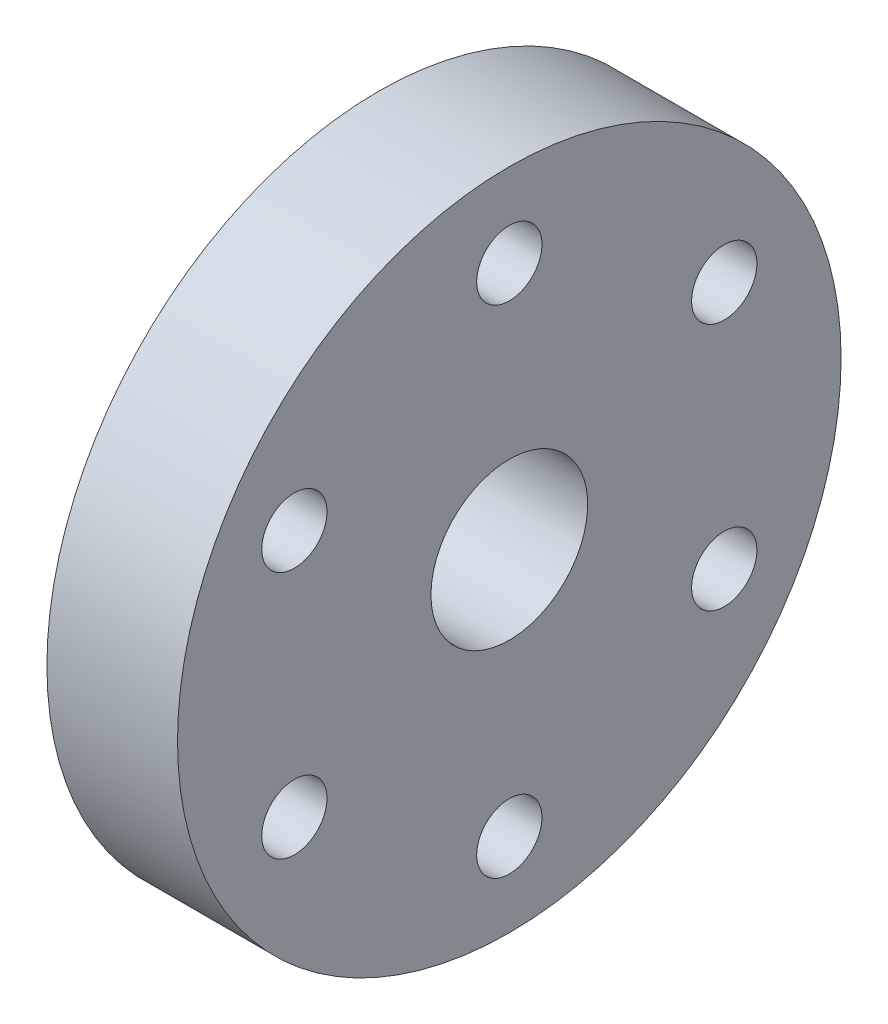
ISO-10303-21;
HEADER;
FILE_DESCRIPTION(('STEP AP214'),'2;1');
FILE_NAME('part.step','',(''),(''),'','','');
FILE_SCHEMA(('AUTOMOTIVE_DESIGN { 1 0 10303 214 1 1 1 1 }'));
ENDSEC;
DATA;
#1=APPLICATION_CONTEXT('core data for automotive mechanical design processes');
#2=APPLICATION_PROTOCOL_DEFINITION('international standard','automotive_design',2000,#1);
#3=PRODUCT_CONTEXT('',#1,'mechanical');
#4=PRODUCT('Part','Part','',(#3));
#5=PRODUCT_RELATED_PRODUCT_CATEGORY('part','',(#4));
#6=PRODUCT_DEFINITION_FORMATION('','',#4);
#7=PRODUCT_DEFINITION_CONTEXT('part definition',#1,'design');
#8=PRODUCT_DEFINITION('design','',#6,#7);
#9=PRODUCT_DEFINITION_SHAPE('','',#8);
#10=(LENGTH_UNIT() NAMED_UNIT(*) SI_UNIT(.MILLI.,.METRE.));
#11=(NAMED_UNIT(*) PLANE_ANGLE_UNIT() SI_UNIT($,.RADIAN.));
#12=(NAMED_UNIT(*) SI_UNIT($,.STERADIAN.) SOLID_ANGLE_UNIT());
#13=UNCERTAINTY_MEASURE_WITH_UNIT(LENGTH_MEASURE(1.E-05),#10,'distance_accuracy_value','');
#14=(GEOMETRIC_REPRESENTATION_CONTEXT(3) GLOBAL_UNCERTAINTY_ASSIGNED_CONTEXT((#13)) GLOBAL_UNIT_ASSIGNED_CONTEXT((#10,
#11,#12)) REPRESENTATION_CONTEXT('',''));
#15=CARTESIAN_POINT('',(0.,0.,0.));
#16=DIRECTION('',(0.,0.,1.));
#17=DIRECTION('',(1.,0.,0.));
#18=AXIS2_PLACEMENT_3D('',#15,#16,#17);
#19=CARTESIAN_POINT('',(0.,0.,0.));
#20=DIRECTION('',(-1.,0.,0.));
#21=DIRECTION('',(0.,0.,1.));
#22=AXIS2_PLACEMENT_3D('',#19,#20,#21);
#23=CYLINDRICAL_SURFACE('',#22,3.);
#24=CARTESIAN_POINT('',(9.2,0.,0.));
#25=DIRECTION('',(-1.,0.,0.));
#26=DIRECTION('',(0.,0.,1.));
#27=AXIS2_PLACEMENT_3D('',#24,#25,#26);
#28=CIRCLE('',#27,3.);
#29=CARTESIAN_POINT('',(9.2,0.,3.));
#30=VERTEX_POINT('',#29);
#31=EDGE_CURVE('E53',#30,#30,#28,.T.);
#32=ORIENTED_EDGE('',*,*,#31,.F.);
#33=EDGE_LOOP('',(#32));
#34=FACE_BOUND('',#33,.T.);
#35=CARTESIAN_POINT('',(0.,0.,0.));
#36=DIRECTION('',(-1.,0.,0.));
#37=DIRECTION('',(0.,0.,1.));
#38=AXIS2_PLACEMENT_3D('',#35,#36,#37);
#39=CIRCLE('',#38,3.);
#40=CARTESIAN_POINT('',(0.,0.,3.));
#41=VERTEX_POINT('',#40);
#42=EDGE_CURVE('E10',#41,#41,#39,.T.);
#43=ORIENTED_EDGE('',*,*,#42,.T.);
#44=EDGE_LOOP('',(#43));
#45=FACE_BOUND('',#44,.T.);
#46=ADVANCED_FACE('F31',(#34,#45),#23,.F.);
#47=CARTESIAN_POINT('',(0.,3.,0.));
#48=DIRECTION('',(1.,0.,0.));
#49=DIRECTION('',(0.,0.,-1.));
#50=AXIS2_PLACEMENT_3D('',#47,#48,#49);
#51=PLANE('',#50);
#52=ORIENTED_EDGE('',*,*,#42,.F.);
#53=EDGE_LOOP('',(#52));
#54=FACE_BOUND('',#53,.T.);
#55=CARTESIAN_POINT('',(0.,0.,0.));
#56=DIRECTION('',(-1.,0.,0.));
#57=DIRECTION('',(0.,0.,1.));
#58=AXIS2_PLACEMENT_3D('',#55,#56,#57);
#59=CIRCLE('',#58,6.);
#60=CARTESIAN_POINT('',(0.,0.,6.));
#61=VERTEX_POINT('',#60);
#62=EDGE_CURVE('E37',#61,#61,#59,.T.);
#63=ORIENTED_EDGE('',*,*,#62,.T.);
#64=EDGE_LOOP('',(#63));
#65=FACE_BOUND('',#64,.T.);
#66=ADVANCED_FACE('F129',(#54,#65),#51,.F.);
#67=CARTESIAN_POINT('',(0.,0.,0.));
#68=DIRECTION('',(-1.,0.,0.));
#69=DIRECTION('',(0.,0.,1.));
#70=AXIS2_PLACEMENT_3D('',#67,#68,#69);
#71=CYLINDRICAL_SURFACE('',#70,6.);
#72=ORIENTED_EDGE('',*,*,#62,.F.);
#73=EDGE_LOOP('',(#72));
#74=FACE_BOUND('',#73,.T.);
#75=CARTESIAN_POINT('',(4.2,0.,0.));
#76=DIRECTION('',(-1.,0.,0.));
#77=DIRECTION('',(0.,0.,1.));
#78=AXIS2_PLACEMENT_3D('',#75,#76,#77);
#79=CIRCLE('',#78,6.);
#80=CARTESIAN_POINT('',(4.2,0.,6.));
#81=VERTEX_POINT('',#80);
#82=EDGE_CURVE('E41',#81,#81,#79,.T.);
#83=ORIENTED_EDGE('',*,*,#82,.T.);
#84=EDGE_LOOP('',(#83));
#85=FACE_BOUND('',#84,.T.);
#86=ADVANCED_FACE('F99',(#74,#85),#71,.T.);
#87=CARTESIAN_POINT('',(4.2,6.,0.));
#88=DIRECTION('',(1.,0.,0.));
#89=DIRECTION('',(0.,0.,-1.));
#90=AXIS2_PLACEMENT_3D('',#87,#88,#89);
#91=PLANE('',#90);
#92=CARTESIAN_POINT('',(4.2,4.7500000000001,8.22724133595211));
#93=DIRECTION('',(-1.,0.,0.));
#94=DIRECTION('',(0.,0.,1.));
#95=AXIS2_PLACEMENT_3D('',#92,#93,#94);
#96=CIRCLE('',#95,1.24999999999999);
#97=CARTESIAN_POINT('',(4.2,4.7500000000001,9.4772413359521));
#98=VERTEX_POINT('',#97);
#99=EDGE_CURVE('E89',#98,#98,#96,.T.);
#100=ORIENTED_EDGE('',*,*,#99,.F.);
#101=EDGE_LOOP('',(#100));
#102=FACE_BOUND('',#101,.T.);
#103=CARTESIAN_POINT('',(4.2,-4.74999999999992,8.22724133595221));
#104=DIRECTION('',(-1.,0.,0.));
#105=DIRECTION('',(0.,0.,1.));
#106=AXIS2_PLACEMENT_3D('',#103,#104,#105);
#107=CIRCLE('',#106,1.24999999999999);
#108=CARTESIAN_POINT('',(4.2,-4.74999999999992,9.4772413359522));
#109=VERTEX_POINT('',#108);
#110=EDGE_CURVE('E83',#109,#109,#107,.T.);
#111=ORIENTED_EDGE('',*,*,#110,.F.);
#112=EDGE_LOOP('',(#111));
#113=FACE_BOUND('',#112,.T.);
#114=CARTESIAN_POINT('',(4.2,-9.5,0.));
#115=DIRECTION('',(-1.,0.,0.));
#116=DIRECTION('',(0.,0.,1.));
#117=AXIS2_PLACEMENT_3D('',#114,#115,#116);
#118=CIRCLE('',#117,1.24999999999999);
#119=CARTESIAN_POINT('',(4.2,-9.5,1.24999999999999));
#120=VERTEX_POINT('',#119);
#121=EDGE_CURVE('E77',#120,#120,#118,.T.);
#122=ORIENTED_EDGE('',*,*,#121,.F.);
#123=EDGE_LOOP('',(#122));
#124=FACE_BOUND('',#123,.T.);
#125=CARTESIAN_POINT('',(4.2,-4.75000000000004,-8.22724133595215));
#126=DIRECTION('',(-1.,0.,0.));
#127=DIRECTION('',(0.,0.,1.));
#128=AXIS2_PLACEMENT_3D('',#125,#126,#127);
#129=CIRCLE('',#128,1.24999999999999);
#130=CARTESIAN_POINT('',(4.2,-4.75000000000004,-6.97724133595216));
#131=VERTEX_POINT('',#130);
#132=EDGE_CURVE('E71',#131,#131,#129,.T.);
#133=ORIENTED_EDGE('',*,*,#132,.F.);
#134=EDGE_LOOP('',(#133));
#135=FACE_BOUND('',#134,.T.);
#136=CARTESIAN_POINT('',(4.2,4.74999999999998,-8.22724133595218));
#137=DIRECTION('',(-1.,0.,0.));
#138=DIRECTION('',(0.,0.,1.));
#139=AXIS2_PLACEMENT_3D('',#136,#137,#138);
#140=CIRCLE('',#139,1.24999999999999);
#141=CARTESIAN_POINT('',(4.2,4.74999999999998,-6.97724133595219));
#142=VERTEX_POINT('',#141);
#143=EDGE_CURVE('E65',#142,#142,#140,.T.);
#144=ORIENTED_EDGE('',*,*,#143,.F.);
#145=EDGE_LOOP('',(#144));
#146=FACE_BOUND('',#145,.T.);
#147=CARTESIAN_POINT('',(4.2,9.5,0.));
#148=DIRECTION('',(-1.,0.,0.));
#149=DIRECTION('',(0.,0.,1.));
#150=AXIS2_PLACEMENT_3D('',#147,#148,#149);
#151=CIRCLE('',#150,1.24999999999999);
#152=CARTESIAN_POINT('',(4.2,9.5,1.24999999999999));
#153=VERTEX_POINT('',#152);
#154=EDGE_CURVE('E59',#153,#153,#151,.T.);
#155=ORIENTED_EDGE('',*,*,#154,.F.);
#156=EDGE_LOOP('',(#155));
#157=FACE_BOUND('',#156,.T.);
#158=ORIENTED_EDGE('',*,*,#82,.F.);
#159=EDGE_LOOP('',(#158));
#160=FACE_BOUND('',#159,.T.);
#161=CARTESIAN_POINT('',(4.2,0.,0.));
#162=DIRECTION('',(-1.,0.,0.));
#163=DIRECTION('',(0.,0.,1.));
#164=AXIS2_PLACEMENT_3D('',#161,#162,#163);
#165=CIRCLE('',#164,12.7);
#166=CARTESIAN_POINT('',(4.2,0.,12.7));
#167=VERTEX_POINT('',#166);
#168=EDGE_CURVE('E45',#167,#167,#165,.T.);
#169=ORIENTED_EDGE('',*,*,#168,.T.);
#170=EDGE_LOOP('',(#169));
#171=FACE_BOUND('',#170,.T.);
#172=ADVANCED_FACE('F95',(#102,#113,#124,#135,#146,#157,#160,#171),#91,.F.);
#173=CARTESIAN_POINT('',(0.,0.,0.));
#174=DIRECTION('',(-1.,0.,0.));
#175=DIRECTION('',(0.,0.,1.));
#176=AXIS2_PLACEMENT_3D('',#173,#174,#175);
#177=CYLINDRICAL_SURFACE('',#176,12.7);
#178=ORIENTED_EDGE('',*,*,#168,.F.);
#179=EDGE_LOOP('',(#178));
#180=FACE_BOUND('',#179,.T.);
#181=CARTESIAN_POINT('',(9.2,0.,0.));
#182=DIRECTION('',(-1.,0.,0.));
#183=DIRECTION('',(0.,0.,1.));
#184=AXIS2_PLACEMENT_3D('',#181,#182,#183);
#185=CIRCLE('',#184,12.7);
#186=CARTESIAN_POINT('',(9.2,0.,12.7));
#187=VERTEX_POINT('',#186);
#188=EDGE_CURVE('E50',#187,#187,#185,.T.);
#189=ORIENTED_EDGE('',*,*,#188,.T.);
#190=EDGE_LOOP('',(#189));
#191=FACE_BOUND('',#190,.T.);
#192=ADVANCED_FACE('F98',(#180,#191),#177,.T.);
#193=CARTESIAN_POINT('',(9.2,12.7,0.));
#194=DIRECTION('',(-1.,0.,0.));
#195=DIRECTION('',(0.,0.,1.));
#196=AXIS2_PLACEMENT_3D('',#193,#194,#195);
#197=PLANE('',#196);
#198=CARTESIAN_POINT('',(9.2,4.7500000000001,8.22724133595211));
#199=DIRECTION('',(-1.,0.,0.));
#200=DIRECTION('',(0.,0.,1.));
#201=AXIS2_PLACEMENT_3D('',#198,#199,#200);
#202=CIRCLE('',#201,1.24999999999999);
#203=CARTESIAN_POINT('',(9.2,4.7500000000001,9.4772413359521));
#204=VERTEX_POINT('',#203);
#205=EDGE_CURVE('E86',#204,#204,#202,.T.);
#206=ORIENTED_EDGE('',*,*,#205,.T.);
#207=EDGE_LOOP('',(#206));
#208=FACE_BOUND('',#207,.T.);
#209=CARTESIAN_POINT('',(9.2,-4.74999999999992,8.22724133595221));
#210=DIRECTION('',(-1.,0.,0.));
#211=DIRECTION('',(0.,0.,1.));
#212=AXIS2_PLACEMENT_3D('',#209,#210,#211);
#213=CIRCLE('',#212,1.24999999999999);
#214=CARTESIAN_POINT('',(9.2,-4.74999999999992,9.4772413359522));
#215=VERTEX_POINT('',#214);
#216=EDGE_CURVE('E80',#215,#215,#213,.T.);
#217=ORIENTED_EDGE('',*,*,#216,.T.);
#218=EDGE_LOOP('',(#217));
#219=FACE_BOUND('',#218,.T.);
#220=CARTESIAN_POINT('',(9.2,-9.5,0.));
#221=DIRECTION('',(-1.,0.,0.));
#222=DIRECTION('',(0.,0.,1.));
#223=AXIS2_PLACEMENT_3D('',#220,#221,#222);
#224=CIRCLE('',#223,1.24999999999999);
#225=CARTESIAN_POINT('',(9.2,-9.5,1.24999999999999));
#226=VERTEX_POINT('',#225);
#227=EDGE_CURVE('E74',#226,#226,#224,.T.);
#228=ORIENTED_EDGE('',*,*,#227,.T.);
#229=EDGE_LOOP('',(#228));
#230=FACE_BOUND('',#229,.T.);
#231=CARTESIAN_POINT('',(9.2,-4.75000000000004,-8.22724133595215));
#232=DIRECTION('',(-1.,0.,0.));
#233=DIRECTION('',(0.,0.,1.));
#234=AXIS2_PLACEMENT_3D('',#231,#232,#233);
#235=CIRCLE('',#234,1.24999999999999);
#236=CARTESIAN_POINT('',(9.2,-4.75000000000004,-6.97724133595215));
#237=VERTEX_POINT('',#236);
#238=EDGE_CURVE('E68',#237,#237,#235,.T.);
#239=ORIENTED_EDGE('',*,*,#238,.T.);
#240=EDGE_LOOP('',(#239));
#241=FACE_BOUND('',#240,.T.);
#242=CARTESIAN_POINT('',(9.2,4.74999999999998,-8.22724133595218));
#243=DIRECTION('',(-1.,0.,0.));
#244=DIRECTION('',(0.,0.,1.));
#245=AXIS2_PLACEMENT_3D('',#242,#243,#244);
#246=CIRCLE('',#245,1.24999999999999);
#247=CARTESIAN_POINT('',(9.2,4.74999999999998,-6.97724133595218));
#248=VERTEX_POINT('',#247);
#249=EDGE_CURVE('E62',#248,#248,#246,.T.);
#250=ORIENTED_EDGE('',*,*,#249,.T.);
#251=EDGE_LOOP('',(#250));
#252=FACE_BOUND('',#251,.T.);
#253=CARTESIAN_POINT('',(9.2,9.5,0.));
#254=DIRECTION('',(-1.,0.,0.));
#255=DIRECTION('',(0.,0.,1.));
#256=AXIS2_PLACEMENT_3D('',#253,#254,#255);
#257=CIRCLE('',#256,1.24999999999999);
#258=CARTESIAN_POINT('',(9.2,9.5,1.24999999999999));
#259=VERTEX_POINT('',#258);
#260=EDGE_CURVE('E56',#259,#259,#257,.T.);
#261=ORIENTED_EDGE('',*,*,#260,.T.);
#262=EDGE_LOOP('',(#261));
#263=FACE_BOUND('',#262,.T.);
#264=ORIENTED_EDGE('',*,*,#188,.F.);
#265=EDGE_LOOP('',(#264));
#266=FACE_BOUND('',#265,.T.);
#267=ORIENTED_EDGE('',*,*,#31,.T.);
#268=EDGE_LOOP('',(#267));
#269=FACE_BOUND('',#268,.T.);
#270=ADVANCED_FACE('F117',(#208,#219,#230,#241,#252,#263,#266,#269),#197,.F.);
#271=CARTESIAN_POINT('',(4.2,9.5,0.));
#272=DIRECTION('',(-1.,0.,0.));
#273=DIRECTION('',(0.,0.,1.));
#274=AXIS2_PLACEMENT_3D('',#271,#272,#273);
#275=CYLINDRICAL_SURFACE('',#274,1.24999999999999);
#276=ORIENTED_EDGE('',*,*,#260,.F.);
#277=EDGE_LOOP('',(#276));
#278=FACE_BOUND('',#277,.T.);
#279=ORIENTED_EDGE('',*,*,#154,.T.);
#280=EDGE_LOOP('',(#279));
#281=FACE_BOUND('',#280,.T.);
#282=ADVANCED_FACE('F123',(#278,#281),#275,.F.);
#283=CARTESIAN_POINT('',(4.2,4.74999999999998,-8.22724133595218));
#284=DIRECTION('',(-1.,0.,0.));
#285=DIRECTION('',(0.,0.,1.));
#286=AXIS2_PLACEMENT_3D('',#283,#284,#285);
#287=CYLINDRICAL_SURFACE('',#286,1.24999999999999);
#288=ORIENTED_EDGE('',*,*,#249,.F.);
#289=EDGE_LOOP('',(#288));
#290=FACE_BOUND('',#289,.T.);
#291=ORIENTED_EDGE('',*,*,#143,.T.);
#292=EDGE_LOOP('',(#291));
#293=FACE_BOUND('',#292,.T.);
#294=ADVANCED_FACE('F142',(#290,#293),#287,.F.);
#295=CARTESIAN_POINT('',(4.2,-4.75000000000004,-8.22724133595215));
#296=DIRECTION('',(-1.,0.,0.));
#297=DIRECTION('',(0.,0.,1.));
#298=AXIS2_PLACEMENT_3D('',#295,#296,#297);
#299=CYLINDRICAL_SURFACE('',#298,1.24999999999999);
#300=ORIENTED_EDGE('',*,*,#238,.F.);
#301=EDGE_LOOP('',(#300));
#302=FACE_BOUND('',#301,.T.);
#303=ORIENTED_EDGE('',*,*,#132,.T.);
#304=EDGE_LOOP('',(#303));
#305=FACE_BOUND('',#304,.T.);
#306=ADVANCED_FACE('F146',(#302,#305),#299,.F.);
#307=CARTESIAN_POINT('',(4.2,-9.5,0.));
#308=DIRECTION('',(-1.,0.,0.));
#309=DIRECTION('',(0.,0.,1.));
#310=AXIS2_PLACEMENT_3D('',#307,#308,#309);
#311=CYLINDRICAL_SURFACE('',#310,1.24999999999999);
#312=ORIENTED_EDGE('',*,*,#227,.F.);
#313=EDGE_LOOP('',(#312));
#314=FACE_BOUND('',#313,.T.);
#315=ORIENTED_EDGE('',*,*,#121,.T.);
#316=EDGE_LOOP('',(#315));
#317=FACE_BOUND('',#316,.T.);
#318=ADVANCED_FACE('F150',(#314,#317),#311,.F.);
#319=CARTESIAN_POINT('',(4.2,-4.74999999999992,8.22724133595221));
#320=DIRECTION('',(-1.,0.,0.));
#321=DIRECTION('',(0.,0.,1.));
#322=AXIS2_PLACEMENT_3D('',#319,#320,#321);
#323=CYLINDRICAL_SURFACE('',#322,1.24999999999999);
#324=ORIENTED_EDGE('',*,*,#216,.F.);
#325=EDGE_LOOP('',(#324));
#326=FACE_BOUND('',#325,.T.);
#327=ORIENTED_EDGE('',*,*,#110,.T.);
#328=EDGE_LOOP('',(#327));
#329=FACE_BOUND('',#328,.T.);
#330=ADVANCED_FACE('F154',(#326,#329),#323,.F.);
#331=CARTESIAN_POINT('',(4.2,4.7500000000001,8.22724133595211));
#332=DIRECTION('',(-1.,0.,0.));
#333=DIRECTION('',(0.,0.,1.));
#334=AXIS2_PLACEMENT_3D('',#331,#332,#333);
#335=CYLINDRICAL_SURFACE('',#334,1.24999999999999);
#336=ORIENTED_EDGE('',*,*,#205,.F.);
#337=EDGE_LOOP('',(#336));
#338=FACE_BOUND('',#337,.T.);
#339=ORIENTED_EDGE('',*,*,#99,.T.);
#340=EDGE_LOOP('',(#339));
#341=FACE_BOUND('',#340,.T.);
#342=ADVANCED_FACE('F93',(#338,#341),#335,.F.);
#343=CLOSED_SHELL('',(#46,#66,#86,#172,#192,#270,#282,#294,#306,#318,#330,#342));
#344=MANIFOLD_SOLID_BREP('B2',#343);
#345=ADVANCED_BREP_SHAPE_REPRESENTATION('',(#18,#344),#14);
#346=SHAPE_DEFINITION_REPRESENTATION(#9,#345);
ENDSEC;
END-ISO-10303-21;
